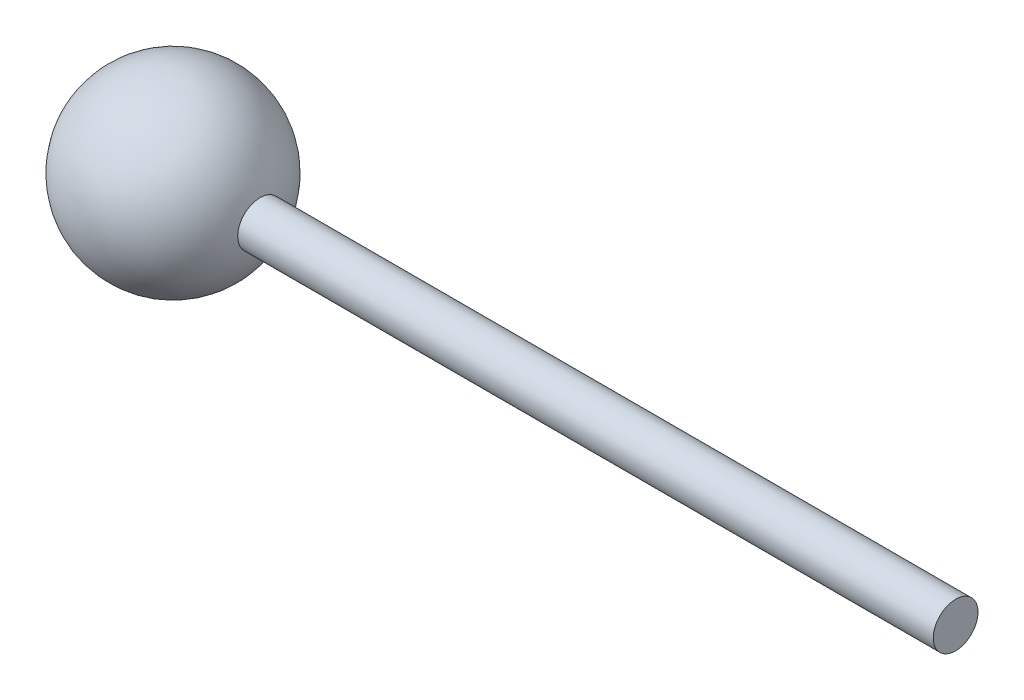
ISO-10303-21;
HEADER;
FILE_DESCRIPTION(('STEP AP214'),'2;1');
FILE_NAME('part.step','',(''),(''),'','','');
FILE_SCHEMA(('AUTOMOTIVE_DESIGN { 1 0 10303 214 1 1 1 1 }'));
ENDSEC;
DATA;
#1=APPLICATION_CONTEXT('core data for automotive mechanical design processes');
#2=APPLICATION_PROTOCOL_DEFINITION('international standard','automotive_design',2000,#1);
#3=PRODUCT_CONTEXT('',#1,'mechanical');
#4=PRODUCT('Part','Part','',(#3));
#5=PRODUCT_RELATED_PRODUCT_CATEGORY('part','',(#4));
#6=PRODUCT_DEFINITION_FORMATION('','',#4);
#7=PRODUCT_DEFINITION_CONTEXT('part definition',#1,'design');
#8=PRODUCT_DEFINITION('design','',#6,#7);
#9=PRODUCT_DEFINITION_SHAPE('','',#8);
#10=(LENGTH_UNIT() NAMED_UNIT(*) SI_UNIT(.MILLI.,.METRE.));
#11=(NAMED_UNIT(*) PLANE_ANGLE_UNIT() SI_UNIT($,.RADIAN.));
#12=(NAMED_UNIT(*) SI_UNIT($,.STERADIAN.) SOLID_ANGLE_UNIT());
#13=UNCERTAINTY_MEASURE_WITH_UNIT(LENGTH_MEASURE(1.E-05),#10,'distance_accuracy_value','');
#14=(GEOMETRIC_REPRESENTATION_CONTEXT(3) GLOBAL_UNCERTAINTY_ASSIGNED_CONTEXT((#13)) GLOBAL_UNIT_ASSIGNED_CONTEXT((#10,
#11,#12)) REPRESENTATION_CONTEXT('',''));
#15=CARTESIAN_POINT('',(0.,0.,0.));
#16=DIRECTION('',(0.,0.,1.));
#17=DIRECTION('',(1.,0.,0.));
#18=AXIS2_PLACEMENT_3D('',#15,#16,#17);
#19=CARTESIAN_POINT('',(-22.225,0.,0.));
#20=DIRECTION('',(0.,1.,0.));
#21=DIRECTION('',(0.,0.,1.));
#22=AXIS2_PLACEMENT_3D('',#19,#20,#21);
#23=SPHERICAL_SURFACE('',#22,5.1054);
#24=CARTESIAN_POINT('',(-22.225,0.,0.));
#25=DIRECTION('',(-1.,0.,0.));
#26=DIRECTION('',(0.,0.,1.));
#27=AXIS2_PLACEMENT_3D('',#24,#25,#26);
#28=SPHERICAL_SURFACE('',#27,5.1054);
#29=CARTESIAN_POINT('',(-17.2800824920935,0.,0.));
#30=DIRECTION('',(-1.,0.,0.));
#31=DIRECTION('',(0.,0.,1.));
#32=AXIS2_PLACEMENT_3D('',#29,#30,#31);
#33=CIRCLE('',#32,1.27);
#34=CARTESIAN_POINT('',(-17.2800824920935,0.,1.27));
#35=VERTEX_POINT('',#34);
#36=EDGE_CURVE('E34',#35,#35,#33,.F.);
#37=ORIENTED_EDGE('',*,*,#36,.F.);
#38=EDGE_LOOP('',(#37));
#39=FACE_BOUND('',#38,.T.);
#40=ADVANCED_FACE('F30',(#39),#28,.T.);
#41=CARTESIAN_POINT('',(22.225,0.,0.));
#42=DIRECTION('',(-1.,0.,0.));
#43=DIRECTION('',(0.,0.,1.));
#44=AXIS2_PLACEMENT_3D('',#41,#42,#43);
#45=CYLINDRICAL_SURFACE('',#44,1.27);
#46=ORIENTED_EDGE('',*,*,#36,.T.);
#47=EDGE_LOOP('',(#46));
#48=FACE_BOUND('',#47,.T.);
#49=CARTESIAN_POINT('',(22.225,0.,0.));
#50=DIRECTION('',(1.,0.,0.));
#51=DIRECTION('',(0.,0.,-1.));
#52=AXIS2_PLACEMENT_3D('',#49,#50,#51);
#53=CIRCLE('',#52,1.27);
#54=CARTESIAN_POINT('',(22.225,0.,-1.27));
#55=VERTEX_POINT('',#54);
#56=EDGE_CURVE('E10',#55,#55,#53,.T.);
#57=ORIENTED_EDGE('',*,*,#56,.F.);
#58=EDGE_LOOP('',(#57));
#59=FACE_BOUND('',#58,.T.);
#60=ADVANCED_FACE('F32',(#48,#59),#45,.T.);
#61=CARTESIAN_POINT('',(22.225,0.,0.));
#62=DIRECTION('',(1.,0.,0.));
#63=DIRECTION('',(0.,0.,-1.));
#64=AXIS2_PLACEMENT_3D('',#61,#62,#63);
#65=PLANE('',#64);
#66=ORIENTED_EDGE('',*,*,#56,.T.);
#67=EDGE_LOOP('',(#66));
#68=FACE_BOUND('',#67,.T.);
#69=ADVANCED_FACE('F50',(#68),#65,.T.);
#70=CLOSED_SHELL('',(#40,#60,#69));
#71=MANIFOLD_SOLID_BREP('B2',#70);
#72=ADVANCED_BREP_SHAPE_REPRESENTATION('',(#18,#71),#14);
#73=SHAPE_DEFINITION_REPRESENTATION(#9,#72);
ENDSEC;
END-ISO-10303-21;
